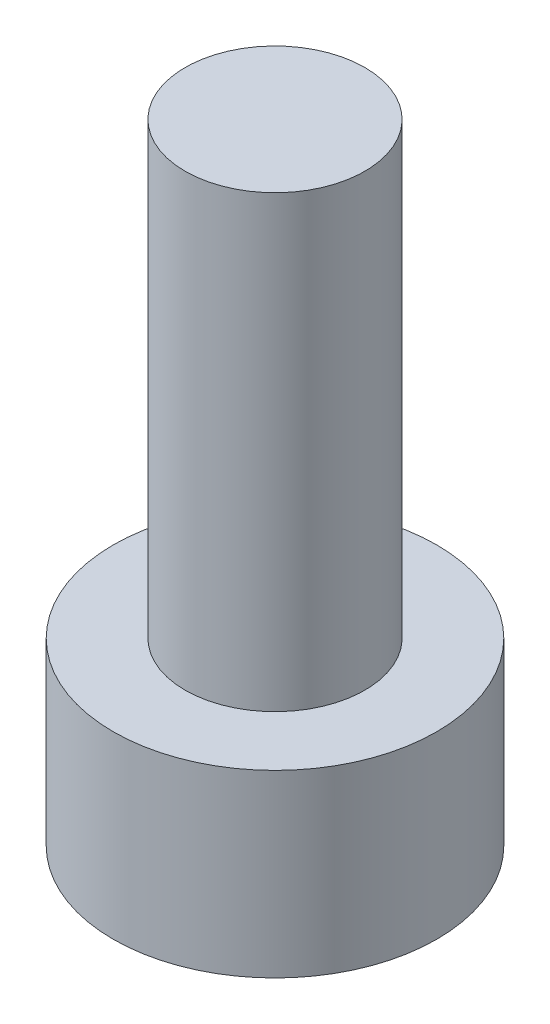
ISO-10303-21;
HEADER;
FILE_DESCRIPTION(('STEP AP214'),'2;1');
FILE_NAME('part.step','',(''),(''),'','','');
FILE_SCHEMA(('AUTOMOTIVE_DESIGN { 1 0 10303 214 1 1 1 1 }'));
ENDSEC;
DATA;
#1=APPLICATION_CONTEXT('core data for automotive mechanical design processes');
#2=APPLICATION_PROTOCOL_DEFINITION('international standard','automotive_design',2000,#1);
#3=PRODUCT_CONTEXT('',#1,'mechanical');
#4=PRODUCT('Part','Part','',(#3));
#5=PRODUCT_RELATED_PRODUCT_CATEGORY('part','',(#4));
#6=PRODUCT_DEFINITION_FORMATION('','',#4);
#7=PRODUCT_DEFINITION_CONTEXT('part definition',#1,'design');
#8=PRODUCT_DEFINITION('design','',#6,#7);
#9=PRODUCT_DEFINITION_SHAPE('','',#8);
#10=(LENGTH_UNIT() NAMED_UNIT(*) SI_UNIT(.MILLI.,.METRE.));
#11=(NAMED_UNIT(*) PLANE_ANGLE_UNIT() SI_UNIT($,.RADIAN.));
#12=(NAMED_UNIT(*) SI_UNIT($,.STERADIAN.) SOLID_ANGLE_UNIT());
#13=UNCERTAINTY_MEASURE_WITH_UNIT(LENGTH_MEASURE(1.E-05),#10,'distance_accuracy_value','');
#14=(GEOMETRIC_REPRESENTATION_CONTEXT(3) GLOBAL_UNCERTAINTY_ASSIGNED_CONTEXT((#13)) GLOBAL_UNIT_ASSIGNED_CONTEXT((#10,
#11,#12)) REPRESENTATION_CONTEXT('',''));
#15=CARTESIAN_POINT('',(0.,0.,0.));
#16=DIRECTION('',(0.,0.,1.));
#17=DIRECTION('',(1.,0.,0.));
#18=AXIS2_PLACEMENT_3D('',#15,#16,#17);
#19=CARTESIAN_POINT('',(0.,6.35,0.));
#20=DIRECTION('',(0.,-1.,0.));
#21=DIRECTION('',(0.,0.,-1.));
#22=AXIS2_PLACEMENT_3D('',#19,#20,#21);
#23=CYLINDRICAL_SURFACE('',#22,1.27);
#24=CARTESIAN_POINT('',(0.,6.35,0.));
#25=DIRECTION('',(0.,1.,0.));
#26=DIRECTION('',(0.,0.,1.));
#27=AXIS2_PLACEMENT_3D('',#24,#25,#26);
#28=CIRCLE('',#27,1.27);
#29=CARTESIAN_POINT('',(0.,6.35,1.27));
#30=VERTEX_POINT('',#29);
#31=EDGE_CURVE('E11',#30,#30,#28,.T.);
#32=ORIENTED_EDGE('',*,*,#31,.F.);
#33=EDGE_LOOP('',(#32));
#34=FACE_BOUND('',#33,.T.);
#35=CARTESIAN_POINT('',(0.,0.,0.));
#36=DIRECTION('',(0.,1.,0.));
#37=DIRECTION('',(0.,0.,1.));
#38=AXIS2_PLACEMENT_3D('',#35,#36,#37);
#39=CIRCLE('',#38,1.27);
#40=CARTESIAN_POINT('',(0.,0.,1.27));
#41=VERTEX_POINT('',#40);
#42=EDGE_CURVE('E38',#41,#41,#39,.T.);
#43=ORIENTED_EDGE('',*,*,#42,.T.);
#44=EDGE_LOOP('',(#43));
#45=FACE_BOUND('',#44,.T.);
#46=ADVANCED_FACE('F35',(#34,#45),#23,.T.);
#47=CARTESIAN_POINT('',(0.,6.35,0.));
#48=DIRECTION('',(0.,1.,0.));
#49=DIRECTION('',(0.,0.,1.));
#50=AXIS2_PLACEMENT_3D('',#47,#48,#49);
#51=PLANE('',#50);
#52=ORIENTED_EDGE('',*,*,#31,.T.);
#53=EDGE_LOOP('',(#52));
#54=FACE_BOUND('',#53,.T.);
#55=ADVANCED_FACE('F167',(#54),#51,.T.);
#56=CARTESIAN_POINT('',(0.,-2.54,0.));
#57=DIRECTION('',(0.,1.,0.));
#58=DIRECTION('',(0.,0.,1.));
#59=AXIS2_PLACEMENT_3D('',#56,#57,#58);
#60=CYLINDRICAL_SURFACE('',#59,2.286);
#61=CARTESIAN_POINT('',(0.,-2.54,0.));
#62=DIRECTION('',(0.,-1.,0.));
#63=DIRECTION('',(0.,0.,-1.));
#64=AXIS2_PLACEMENT_3D('',#61,#62,#63);
#65=CIRCLE('',#64,2.286);
#66=CARTESIAN_POINT('',(0.,-2.54,-2.286));
#67=VERTEX_POINT('',#66);
#68=EDGE_CURVE('E142',#67,#67,#65,.T.);
#69=ORIENTED_EDGE('',*,*,#68,.F.);
#70=EDGE_LOOP('',(#69));
#71=FACE_BOUND('',#70,.T.);
#72=CARTESIAN_POINT('',(0.,0.,0.));
#73=DIRECTION('',(0.,-1.,0.));
#74=DIRECTION('',(0.,0.,-1.));
#75=AXIS2_PLACEMENT_3D('',#72,#73,#74);
#76=CIRCLE('',#75,2.286);
#77=CARTESIAN_POINT('',(0.,0.,-2.286));
#78=VERTEX_POINT('',#77);
#79=EDGE_CURVE('E136',#78,#78,#76,.T.);
#80=ORIENTED_EDGE('',*,*,#79,.T.);
#81=EDGE_LOOP('',(#80));
#82=FACE_BOUND('',#81,.T.);
#83=ADVANCED_FACE('F148',(#71,#82),#60,.T.);
#84=CARTESIAN_POINT('',(0.,-2.54,0.));
#85=DIRECTION('',(0.,-1.,0.));
#86=DIRECTION('',(0.,0.,-1.));
#87=AXIS2_PLACEMENT_3D('',#84,#85,#86);
#88=PLANE('',#87);
#89=DIRECTION('',(0.883816000890019,0.,-0.467834667987286));
#90=VECTOR('',#89,1.);
#91=CARTESIAN_POINT('',(-1.56833371963182,-2.54,-0.984049185708491));
#92=LINE('',#91,#90);
#93=CARTESIAN_POINT('',(-1.56833371963182,-2.54,-0.984049185708491));
#94=VERTEX_POINT('',#93);
#95=CARTESIAN_POINT('',(0.0680447335810338,-2.54,-1.85024143566714));
#96=VERTEX_POINT('',#95);
#97=EDGE_CURVE('E49',#94,#96,#92,.T.);
#98=ORIENTED_EDGE('',*,*,#97,.F.);
#99=DIRECTION('',(0.0367512931969612,0.,-0.999324443035569));
#100=VECTOR('',#99,1.);
#101=CARTESIAN_POINT('',(-1.63637845321285,-2.54,0.866192249958652));
#102=LINE('',#101,#100);
#103=CARTESIAN_POINT('',(-1.63637845321285,-2.54,0.866192249958652));
#104=VERTEX_POINT('',#103);
#105=EDGE_CURVE('E132',#104,#94,#102,.T.);
#106=ORIENTED_EDGE('',*,*,#105,.F.);
#107=DIRECTION('',(-0.847064707693057,0.,-0.531489775048284));
#108=VECTOR('',#107,1.);
#109=CARTESIAN_POINT('',(-0.0680447335810338,-2.54,1.85024143566714));
#110=LINE('',#109,#108);
#111=CARTESIAN_POINT('',(-0.0680447335810338,-2.54,1.85024143566714));
#112=VERTEX_POINT('',#111);
#113=EDGE_CURVE('E130',#112,#104,#110,.T.);
#114=ORIENTED_EDGE('',*,*,#113,.F.);
#115=DIRECTION('',(-0.883816000890019,0.,0.467834667987286));
#116=VECTOR('',#115,1.);
#117=CARTESIAN_POINT('',(1.56833371963182,-2.54,0.98404918570849));
#118=LINE('',#117,#116);
#119=CARTESIAN_POINT('',(1.56833371963182,-2.54,0.98404918570849));
#120=VERTEX_POINT('',#119);
#121=EDGE_CURVE('E97',#120,#112,#118,.T.);
#122=ORIENTED_EDGE('',*,*,#121,.F.);
#123=DIRECTION('',(-0.0367512931969616,0.,0.999324443035569));
#124=VECTOR('',#123,1.);
#125=CARTESIAN_POINT('',(1.63637845321285,-2.54,-0.866192249958652));
#126=LINE('',#125,#124);
#127=CARTESIAN_POINT('',(1.63637845321285,-2.54,-0.866192249958652));
#128=VERTEX_POINT('',#127);
#129=EDGE_CURVE('E126',#128,#120,#126,.T.);
#130=ORIENTED_EDGE('',*,*,#129,.F.);
#131=DIRECTION('',(0.847064707693057,0.,0.531489775048284));
#132=VECTOR('',#131,1.);
#133=CARTESIAN_POINT('',(0.0680447335810338,-2.54,-1.85024143566714));
#134=LINE('',#133,#132);
#135=EDGE_CURVE('E123',#96,#128,#134,.T.);
#136=ORIENTED_EDGE('',*,*,#135,.F.);
#137=EDGE_LOOP('',(#98,#106,#114,#122,#130,#136));
#138=FACE_BOUND('',#137,.T.);
#139=ORIENTED_EDGE('',*,*,#68,.T.);
#140=EDGE_LOOP('',(#139));
#141=FACE_BOUND('',#140,.T.);
#142=ADVANCED_FACE('F153',(#138,#141),#88,.T.);
#143=CARTESIAN_POINT('',(0.,0.,0.));
#144=DIRECTION('',(0.,-1.,0.));
#145=DIRECTION('',(0.,0.,-1.));
#146=AXIS2_PLACEMENT_3D('',#143,#144,#145);
#147=PLANE('',#146);
#148=ORIENTED_EDGE('',*,*,#42,.F.);
#149=EDGE_LOOP('',(#148));
#150=FACE_BOUND('',#149,.T.);
#151=ORIENTED_EDGE('',*,*,#79,.F.);
#152=EDGE_LOOP('',(#151));
#153=FACE_BOUND('',#152,.T.);
#154=ADVANCED_FACE('F150',(#150,#153),#147,.F.);
#155=CARTESIAN_POINT('',(-1.56833371963182,-0.762,-0.984049185708491));
#156=DIRECTION('',(-0.467834667987286,0.,-0.883816000890019));
#157=DIRECTION('',(-0.883816000890019,0.,0.467834667987286));
#158=AXIS2_PLACEMENT_3D('',#155,#156,#157);
#159=PLANE('',#158);
#160=ORIENTED_EDGE('',*,*,#97,.T.);
#161=DIRECTION('',(0.,-1.,0.));
#162=VECTOR('',#161,1.);
#163=CARTESIAN_POINT('',(0.0680447335810338,-0.762,-1.85024143566714));
#164=LINE('',#163,#162);
#165=CARTESIAN_POINT('',(0.0680447335810338,-0.762,-1.85024143566714));
#166=VERTEX_POINT('',#165);
#167=EDGE_CURVE('E79',#166,#96,#164,.T.);
#168=ORIENTED_EDGE('',*,*,#167,.F.);
#169=DIRECTION('',(0.883816000890019,0.,-0.467834667987286));
#170=VECTOR('',#169,1.);
#171=CARTESIAN_POINT('',(-1.56833371963182,-0.762,-0.984049185708491));
#172=LINE('',#171,#170);
#173=CARTESIAN_POINT('',(-1.56833371963182,-0.762,-0.984049185708491));
#174=VERTEX_POINT('',#173);
#175=EDGE_CURVE('E134',#174,#166,#172,.T.);
#176=ORIENTED_EDGE('',*,*,#175,.F.);
#177=DIRECTION('',(0.,-1.,0.));
#178=VECTOR('',#177,1.);
#179=CARTESIAN_POINT('',(-1.56833371963182,-0.762,-0.984049185708491));
#180=LINE('',#179,#178);
#181=EDGE_CURVE('E57',#174,#94,#180,.T.);
#182=ORIENTED_EDGE('',*,*,#181,.T.);
#183=EDGE_LOOP('',(#160,#168,#176,#182));
#184=FACE_BOUND('',#183,.T.);
#185=ADVANCED_FACE('F152',(#184),#159,.F.);
#186=CARTESIAN_POINT('',(-1.63637845321285,-0.762,0.866192249958652));
#187=DIRECTION('',(-0.999324443035569,0.,-0.0367512931969612));
#188=DIRECTION('',(-0.0367512931969612,0.,0.999324443035569));
#189=AXIS2_PLACEMENT_3D('',#186,#187,#188);
#190=PLANE('',#189);
#191=ORIENTED_EDGE('',*,*,#105,.T.);
#192=ORIENTED_EDGE('',*,*,#181,.F.);
#193=DIRECTION('',(0.0367512931969612,0.,-0.999324443035569));
#194=VECTOR('',#193,1.);
#195=CARTESIAN_POINT('',(-1.63637845321285,-0.762,0.866192249958652));
#196=LINE('',#195,#194);
#197=CARTESIAN_POINT('',(-1.63637845321285,-0.762,0.866192249958652));
#198=VERTEX_POINT('',#197);
#199=EDGE_CURVE('E109',#198,#174,#196,.T.);
#200=ORIENTED_EDGE('',*,*,#199,.F.);
#201=DIRECTION('',(0.,-1.,0.));
#202=VECTOR('',#201,1.);
#203=CARTESIAN_POINT('',(-1.63637845321285,-0.762,0.866192249958652));
#204=LINE('',#203,#202);
#205=EDGE_CURVE('E101',#198,#104,#204,.T.);
#206=ORIENTED_EDGE('',*,*,#205,.T.);
#207=EDGE_LOOP('',(#191,#192,#200,#206));
#208=FACE_BOUND('',#207,.T.);
#209=ADVANCED_FACE('F160',(#208),#190,.F.);
#210=CARTESIAN_POINT('',(-0.0680447335810338,-0.762,1.85024143566714));
#211=DIRECTION('',(-0.531489775048284,0.,0.847064707693057));
#212=DIRECTION('',(0.847064707693057,0.,0.531489775048284));
#213=AXIS2_PLACEMENT_3D('',#210,#211,#212);
#214=PLANE('',#213);
#215=ORIENTED_EDGE('',*,*,#113,.T.);
#216=ORIENTED_EDGE('',*,*,#205,.F.);
#217=DIRECTION('',(-0.847064707693057,0.,-0.531489775048284));
#218=VECTOR('',#217,1.);
#219=CARTESIAN_POINT('',(-0.0680447335810338,-0.762,1.85024143566714));
#220=LINE('',#219,#218);
#221=CARTESIAN_POINT('',(-0.0680447335810338,-0.762,1.85024143566714));
#222=VERTEX_POINT('',#221);
#223=EDGE_CURVE('E105',#222,#198,#220,.T.);
#224=ORIENTED_EDGE('',*,*,#223,.F.);
#225=DIRECTION('',(0.,-1.,0.));
#226=VECTOR('',#225,1.);
#227=CARTESIAN_POINT('',(-0.0680447335810338,-0.762,1.85024143566714));
#228=LINE('',#227,#226);
#229=EDGE_CURVE('E90',#222,#112,#228,.T.);
#230=ORIENTED_EDGE('',*,*,#229,.T.);
#231=EDGE_LOOP('',(#215,#216,#224,#230));
#232=FACE_BOUND('',#231,.T.);
#233=ADVANCED_FACE('F106',(#232),#214,.F.);
#234=CARTESIAN_POINT('',(1.56833371963182,-0.762,0.98404918570849));
#235=DIRECTION('',(0.467834667987286,0.,0.883816000890019));
#236=DIRECTION('',(0.883816000890019,0.,-0.467834667987286));
#237=AXIS2_PLACEMENT_3D('',#234,#235,#236);
#238=PLANE('',#237);
#239=ORIENTED_EDGE('',*,*,#121,.T.);
#240=ORIENTED_EDGE('',*,*,#229,.F.);
#241=DIRECTION('',(-0.883816000890019,0.,0.467834667987286));
#242=VECTOR('',#241,1.);
#243=CARTESIAN_POINT('',(1.56833371963182,-0.762,0.98404918570849));
#244=LINE('',#243,#242);
#245=CARTESIAN_POINT('',(1.56833371963182,-0.762,0.98404918570849));
#246=VERTEX_POINT('',#245);
#247=EDGE_CURVE('E94',#246,#222,#244,.T.);
#248=ORIENTED_EDGE('',*,*,#247,.F.);
#249=DIRECTION('',(0.,-1.,0.));
#250=VECTOR('',#249,1.);
#251=CARTESIAN_POINT('',(1.56833371963182,-0.762,0.98404918570849));
#252=LINE('',#251,#250);
#253=EDGE_CURVE('E102',#246,#120,#252,.T.);
#254=ORIENTED_EDGE('',*,*,#253,.T.);
#255=EDGE_LOOP('',(#239,#240,#248,#254));
#256=FACE_BOUND('',#255,.T.);
#257=ADVANCED_FACE('F92',(#256),#238,.F.);
#258=CARTESIAN_POINT('',(1.63637845321285,-0.762,-0.866192249958652));
#259=DIRECTION('',(0.999324443035569,0.,0.0367512931969616));
#260=DIRECTION('',(0.0367512931969616,0.,-0.99932444303557));
#261=AXIS2_PLACEMENT_3D('',#258,#259,#260);
#262=PLANE('',#261);
#263=ORIENTED_EDGE('',*,*,#129,.T.);
#264=ORIENTED_EDGE('',*,*,#253,.F.);
#265=DIRECTION('',(-0.0367512931969616,0.,0.999324443035569));
#266=VECTOR('',#265,1.);
#267=CARTESIAN_POINT('',(1.63637845321285,-0.762,-0.866192249958652));
#268=LINE('',#267,#266);
#269=CARTESIAN_POINT('',(1.63637845321285,-0.762,-0.866192249958652));
#270=VERTEX_POINT('',#269);
#271=EDGE_CURVE('E115',#270,#246,#268,.T.);
#272=ORIENTED_EDGE('',*,*,#271,.F.);
#273=DIRECTION('',(0.,-1.,0.));
#274=VECTOR('',#273,1.);
#275=CARTESIAN_POINT('',(1.63637845321285,-0.762,-0.866192249958652));
#276=LINE('',#275,#274);
#277=EDGE_CURVE('E139',#270,#128,#276,.T.);
#278=ORIENTED_EDGE('',*,*,#277,.T.);
#279=EDGE_LOOP('',(#263,#264,#272,#278));
#280=FACE_BOUND('',#279,.T.);
#281=ADVANCED_FACE('F221',(#280),#262,.F.);
#282=CARTESIAN_POINT('',(0.0680447335810338,-0.762,-1.85024143566714));
#283=DIRECTION('',(0.531489775048284,0.,-0.847064707693057));
#284=DIRECTION('',(-0.847064707693057,0.,-0.531489775048284));
#285=AXIS2_PLACEMENT_3D('',#282,#283,#284);
#286=PLANE('',#285);
#287=ORIENTED_EDGE('',*,*,#135,.T.);
#288=ORIENTED_EDGE('',*,*,#277,.F.);
#289=DIRECTION('',(0.847064707693057,0.,0.531489775048284));
#290=VECTOR('',#289,1.);
#291=CARTESIAN_POINT('',(0.0680447335810338,-0.762,-1.85024143566714));
#292=LINE('',#291,#290);
#293=EDGE_CURVE('E117',#166,#270,#292,.T.);
#294=ORIENTED_EDGE('',*,*,#293,.F.);
#295=ORIENTED_EDGE('',*,*,#167,.T.);
#296=EDGE_LOOP('',(#287,#288,#294,#295));
#297=FACE_BOUND('',#296,.T.);
#298=ADVANCED_FACE('F230',(#297),#286,.F.);
#299=CARTESIAN_POINT('',(0.,-0.762,0.));
#300=DIRECTION('',(0.,-1.,0.));
#301=DIRECTION('',(0.,0.,-1.));
#302=AXIS2_PLACEMENT_3D('',#299,#300,#301);
#303=PLANE('',#302);
#304=ORIENTED_EDGE('',*,*,#175,.T.);
#305=ORIENTED_EDGE('',*,*,#293,.T.);
#306=ORIENTED_EDGE('',*,*,#271,.T.);
#307=ORIENTED_EDGE('',*,*,#247,.T.);
#308=ORIENTED_EDGE('',*,*,#223,.T.);
#309=ORIENTED_EDGE('',*,*,#199,.T.);
#310=EDGE_LOOP('',(#304,#305,#306,#307,#308,#309));
#311=FACE_BOUND('',#310,.T.);
#312=ADVANCED_FACE('F112',(#311),#303,.T.);
#313=CLOSED_SHELL('',(#46,#55,#83,#142,#154,#185,#209,#233,#257,#281,#298,#312));
#314=MANIFOLD_SOLID_BREP('B2',#313);
#315=ADVANCED_BREP_SHAPE_REPRESENTATION('',(#18,#314),#14);
#316=SHAPE_DEFINITION_REPRESENTATION(#9,#315);
ENDSEC;
END-ISO-10303-21;
